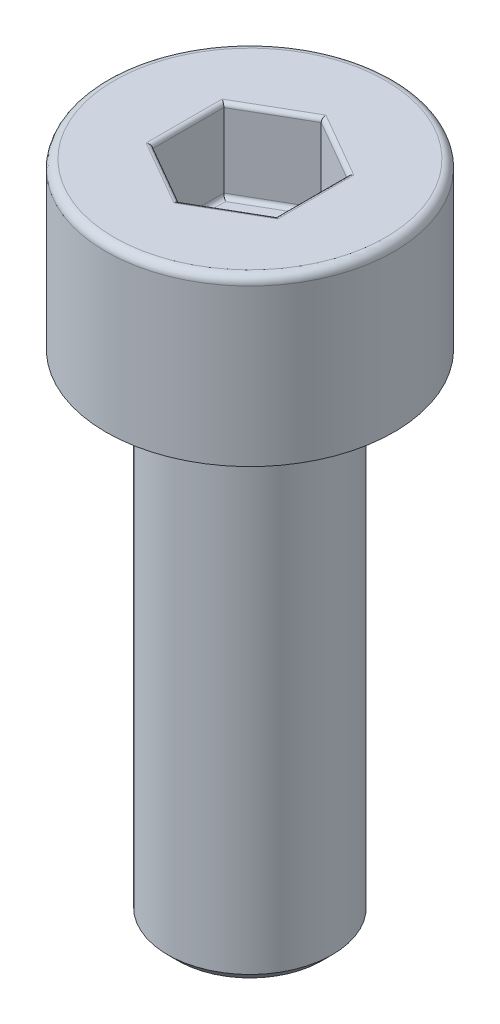
ISO-10303-21;
HEADER;
FILE_DESCRIPTION(('STEP AP214'),'2;1');
FILE_NAME('part.step','',(''),(''),'','','');
FILE_SCHEMA(('AUTOMOTIVE_DESIGN { 1 0 10303 214 1 1 1 1 }'));
ENDSEC;
DATA;
#1=APPLICATION_CONTEXT('core data for automotive mechanical design processes');
#2=APPLICATION_PROTOCOL_DEFINITION('international standard','automotive_design',2000,#1);
#3=PRODUCT_CONTEXT('',#1,'mechanical');
#4=PRODUCT('Part','Part','',(#3));
#5=PRODUCT_RELATED_PRODUCT_CATEGORY('part','',(#4));
#6=PRODUCT_DEFINITION_FORMATION('','',#4);
#7=PRODUCT_DEFINITION_CONTEXT('part definition',#1,'design');
#8=PRODUCT_DEFINITION('design','',#6,#7);
#9=PRODUCT_DEFINITION_SHAPE('','',#8);
#10=(LENGTH_UNIT() NAMED_UNIT(*) SI_UNIT(.MILLI.,.METRE.));
#11=(NAMED_UNIT(*) PLANE_ANGLE_UNIT() SI_UNIT($,.RADIAN.));
#12=(NAMED_UNIT(*) SI_UNIT($,.STERADIAN.) SOLID_ANGLE_UNIT());
#13=UNCERTAINTY_MEASURE_WITH_UNIT(LENGTH_MEASURE(1.E-05),#10,'distance_accuracy_value','');
#14=(GEOMETRIC_REPRESENTATION_CONTEXT(3) GLOBAL_UNCERTAINTY_ASSIGNED_CONTEXT((#13)) GLOBAL_UNIT_ASSIGNED_CONTEXT((#10,
#11,#12)) REPRESENTATION_CONTEXT('',''));
#15=CARTESIAN_POINT('',(0.,0.,0.));
#16=DIRECTION('',(0.,0.,1.));
#17=DIRECTION('',(1.,0.,0.));
#18=AXIS2_PLACEMENT_3D('',#15,#16,#17);
#19=CARTESIAN_POINT('',(0.,-16.,0.));
#20=DIRECTION('',(0.,-1.,0.));
#21=DIRECTION('',(0.,0.,-1.));
#22=AXIS2_PLACEMENT_3D('',#19,#20,#21);
#23=PLANE('',#22);
#24=CARTESIAN_POINT('',(0.,-16.,0.));
#25=DIRECTION('',(0.,-1.,0.));
#26=DIRECTION('',(0.,0.,-1.));
#27=AXIS2_PLACEMENT_3D('',#24,#25,#26);
#28=CIRCLE('',#27,1.75);
#29=CARTESIAN_POINT('',(0.,-16.,-1.75));
#30=VERTEX_POINT('',#29);
#31=EDGE_CURVE('E261',#30,#30,#28,.T.);
#32=ORIENTED_EDGE('',*,*,#31,.T.);
#33=EDGE_LOOP('',(#32));
#34=FACE_BOUND('',#33,.T.);
#35=ADVANCED_FACE('F33',(#34),#23,.T.);
#36=CARTESIAN_POINT('',(0.,0.,0.));
#37=DIRECTION('',(0.,1.,0.));
#38=DIRECTION('',(0.,0.,1.));
#39=AXIS2_PLACEMENT_3D('',#36,#37,#38);
#40=CYLINDRICAL_SURFACE('',#39,2.);
#41=CARTESIAN_POINT('',(0.,-4.25,0.));
#42=DIRECTION('',(0.,-1.,0.));
#43=DIRECTION('',(0.,0.,-1.));
#44=AXIS2_PLACEMENT_3D('',#41,#42,#43);
#45=CIRCLE('',#44,2.);
#46=CARTESIAN_POINT('',(0.,-4.25,-2.));
#47=VERTEX_POINT('',#46);
#48=EDGE_CURVE('E258',#47,#47,#45,.T.);
#49=ORIENTED_EDGE('',*,*,#48,.T.);
#50=EDGE_LOOP('',(#49));
#51=FACE_BOUND('',#50,.T.);
#52=CARTESIAN_POINT('',(0.,-15.75,0.));
#53=DIRECTION('',(0.,-1.,0.));
#54=DIRECTION('',(0.,0.,-1.));
#55=AXIS2_PLACEMENT_3D('',#52,#53,#54);
#56=CIRCLE('',#55,2.);
#57=CARTESIAN_POINT('',(0.,-15.75,-2.));
#58=VERTEX_POINT('',#57);
#59=EDGE_CURVE('E255',#58,#58,#56,.F.);
#60=ORIENTED_EDGE('',*,*,#59,.T.);
#61=EDGE_LOOP('',(#60));
#62=FACE_BOUND('',#61,.T.);
#63=ADVANCED_FACE('F287',(#51,#62),#40,.T.);
#64=CARTESIAN_POINT('',(-2.,-4.,0.));
#65=DIRECTION('',(0.,-1.,0.));
#66=DIRECTION('',(0.,0.,-1.));
#67=AXIS2_PLACEMENT_3D('',#64,#65,#66);
#68=PLANE('',#67);
#69=CARTESIAN_POINT('',(0.,-4.,0.));
#70=DIRECTION('',(0.,-1.,0.));
#71=DIRECTION('',(0.,0.,-1.));
#72=AXIS2_PLACEMENT_3D('',#69,#70,#71);
#73=CIRCLE('',#72,2.25);
#74=CARTESIAN_POINT('',(0.,-4.,-2.25));
#75=VERTEX_POINT('',#74);
#76=EDGE_CURVE('E252',#75,#75,#73,.F.);
#77=ORIENTED_EDGE('',*,*,#76,.T.);
#78=EDGE_LOOP('',(#77));
#79=FACE_BOUND('',#78,.T.);
#80=CARTESIAN_POINT('',(0.,-4.,0.));
#81=DIRECTION('',(0.,1.,0.));
#82=DIRECTION('',(0.,0.,1.));
#83=AXIS2_PLACEMENT_3D('',#80,#81,#82);
#84=CIRCLE('',#83,3.5);
#85=CARTESIAN_POINT('',(0.,-4.,3.5));
#86=VERTEX_POINT('',#85);
#87=EDGE_CURVE('E249',#86,#86,#84,.T.);
#88=ORIENTED_EDGE('',*,*,#87,.F.);
#89=EDGE_LOOP('',(#88));
#90=FACE_BOUND('',#89,.T.);
#91=ADVANCED_FACE('F293',(#79,#90),#68,.T.);
#92=CARTESIAN_POINT('',(0.,0.,0.));
#93=DIRECTION('',(0.,1.,0.));
#94=DIRECTION('',(0.,0.,1.));
#95=AXIS2_PLACEMENT_3D('',#92,#93,#94);
#96=CYLINDRICAL_SURFACE('',#95,3.5);
#97=CARTESIAN_POINT('',(0.,-0.2,0.));
#98=DIRECTION('',(0.,1.,0.));
#99=DIRECTION('',(0.,0.,1.));
#100=AXIS2_PLACEMENT_3D('',#97,#98,#99);
#101=CIRCLE('',#100,3.5);
#102=CARTESIAN_POINT('',(0.,-0.2,3.5));
#103=VERTEX_POINT('',#102);
#104=EDGE_CURVE('E159',#103,#103,#101,.F.);
#105=ORIENTED_EDGE('',*,*,#104,.T.);
#106=EDGE_LOOP('',(#105));
#107=FACE_BOUND('',#106,.T.);
#108=ORIENTED_EDGE('',*,*,#87,.T.);
#109=EDGE_LOOP('',(#108));
#110=FACE_BOUND('',#109,.T.);
#111=ADVANCED_FACE('F303',(#107,#110),#96,.T.);
#112=CARTESIAN_POINT('',(-3.5,0.,0.));
#113=DIRECTION('',(0.,1.,0.));
#114=DIRECTION('',(0.,0.,1.));
#115=AXIS2_PLACEMENT_3D('',#112,#113,#114);
#116=PLANE('',#115);
#117=DIRECTION('',(0.,0.,1.));
#118=VECTOR('',#117,1.);
#119=CARTESIAN_POINT('',(-1.6,0.,-0.86602540378444));
#120=LINE('',#119,#118);
#121=CARTESIAN_POINT('',(-1.6,0.,0.923760430703401));
#122=VERTEX_POINT('',#121);
#123=CARTESIAN_POINT('',(-1.6,0.,-0.923760430703403));
#124=VERTEX_POINT('',#123);
#125=EDGE_CURVE('E175',#122,#124,#120,.F.);
#126=ORIENTED_EDGE('',*,*,#125,.T.);
#127=DIRECTION('',(-0.866025403784439,0.,0.5));
#128=VECTOR('',#127,1.);
#129=CARTESIAN_POINT('',(-0.0499999999999999,0.,-1.81865334794732));
#130=LINE('',#129,#128);
#131=CARTESIAN_POINT('',(0.,0.,-1.8475208614068));
#132=VERTEX_POINT('',#131);
#133=EDGE_CURVE('E134',#124,#132,#130,.F.);
#134=ORIENTED_EDGE('',*,*,#133,.T.);
#135=DIRECTION('',(-0.866025403784439,0.,-0.5));
#136=VECTOR('',#135,1.);
#137=CARTESIAN_POINT('',(1.55,0.,-0.952627944162884));
#138=LINE('',#137,#136);
#139=CARTESIAN_POINT('',(1.6,0.,-0.923760430703403));
#140=VERTEX_POINT('',#139);
#141=EDGE_CURVE('E161',#132,#140,#138,.F.);
#142=ORIENTED_EDGE('',*,*,#141,.T.);
#143=DIRECTION('',(0.,0.,-1.));
#144=VECTOR('',#143,1.);
#145=CARTESIAN_POINT('',(1.6,0.,0.866025403784439));
#146=LINE('',#145,#144);
#147=CARTESIAN_POINT('',(1.6,0.,0.923760430703402));
#148=VERTEX_POINT('',#147);
#149=EDGE_CURVE('E169',#140,#148,#146,.F.);
#150=ORIENTED_EDGE('',*,*,#149,.T.);
#151=DIRECTION('',(0.866025403784439,0.,-0.5));
#152=VECTOR('',#151,1.);
#153=CARTESIAN_POINT('',(0.0499999999999988,0.,1.81865334794732));
#154=LINE('',#153,#152);
#155=CARTESIAN_POINT('',(0.,0.,1.8475208614068));
#156=VERTEX_POINT('',#155);
#157=EDGE_CURVE('E171',#148,#156,#154,.F.);
#158=ORIENTED_EDGE('',*,*,#157,.T.);
#159=DIRECTION('',(0.866025403784439,0.,0.5));
#160=VECTOR('',#159,1.);
#161=CARTESIAN_POINT('',(-1.55,0.,0.952627944162882));
#162=LINE('',#161,#160);
#163=EDGE_CURVE('E173',#156,#122,#162,.F.);
#164=ORIENTED_EDGE('',*,*,#163,.T.);
#165=EDGE_LOOP('',(#126,#134,#142,#150,#158,#164));
#166=FACE_BOUND('',#165,.T.);
#167=CARTESIAN_POINT('',(0.,0.,0.));
#168=DIRECTION('',(0.,1.,0.));
#169=DIRECTION('',(0.,0.,1.));
#170=AXIS2_PLACEMENT_3D('',#167,#168,#169);
#171=CIRCLE('',#170,3.3);
#172=CARTESIAN_POINT('',(0.,0.,3.3));
#173=VERTEX_POINT('',#172);
#174=EDGE_CURVE('E164',#173,#173,#171,.T.);
#175=ORIENTED_EDGE('',*,*,#174,.T.);
#176=EDGE_LOOP('',(#175));
#177=FACE_BOUND('',#176,.T.);
#178=ADVANCED_FACE('F266',(#166,#177),#116,.T.);
#179=CARTESIAN_POINT('',(0.,-4.,0.));
#180=DIRECTION('',(0.,1.,0.));
#181=DIRECTION('',(0.,0.,1.));
#182=AXIS2_PLACEMENT_3D('',#179,#180,#181);
#183=CONICAL_SURFACE('',#182,2.25,0.785398163397454);
#184=ORIENTED_EDGE('',*,*,#48,.F.);
#185=EDGE_LOOP('',(#184));
#186=FACE_BOUND('',#185,.T.);
#187=ORIENTED_EDGE('',*,*,#76,.F.);
#188=EDGE_LOOP('',(#187));
#189=FACE_BOUND('',#188,.T.);
#190=ADVANCED_FACE('F281',(#186,#189),#183,.T.);
#191=CARTESIAN_POINT('',(0.,-15.75,0.));
#192=DIRECTION('',(0.,1.,0.));
#193=DIRECTION('',(0.,0.,1.));
#194=AXIS2_PLACEMENT_3D('',#191,#192,#193);
#195=CONICAL_SURFACE('',#194,2.,0.785398163397446);
#196=ORIENTED_EDGE('',*,*,#31,.F.);
#197=EDGE_LOOP('',(#196));
#198=FACE_BOUND('',#197,.T.);
#199=ORIENTED_EDGE('',*,*,#59,.F.);
#200=EDGE_LOOP('',(#199));
#201=FACE_BOUND('',#200,.T.);
#202=ADVANCED_FACE('F271',(#198,#201),#195,.T.);
#203=CARTESIAN_POINT('',(0.,-0.2,0.));
#204=DIRECTION('',(0.,1.,0.));
#205=DIRECTION('',(0.,0.,1.));
#206=AXIS2_PLACEMENT_3D('',#203,#204,#205);
#207=TOROIDAL_SURFACE('',#206,3.3,0.2);
#208=ORIENTED_EDGE('',*,*,#104,.F.);
#209=EDGE_LOOP('',(#208));
#210=FACE_BOUND('',#209,.T.);
#211=ORIENTED_EDGE('',*,*,#174,.F.);
#212=EDGE_LOOP('',(#211));
#213=FACE_BOUND('',#212,.T.);
#214=ADVANCED_FACE('F268',(#210,#213),#207,.T.);
#215=CARTESIAN_POINT('',(1.5,-2.,-0.86602540378444));
#216=DIRECTION('',(0.5,0.,-0.866025403784439));
#217=DIRECTION('',(-0.866025403784439,0.,-0.5));
#218=AXIS2_PLACEMENT_3D('',#215,#216,#217);
#219=PLANE('',#218);
#220=DIRECTION('',(0.,1.,0.));
#221=VECTOR('',#220,1.);
#222=CARTESIAN_POINT('',(1.5,-2.,-0.86602540378444));
#223=LINE('',#222,#221);
#224=CARTESIAN_POINT('',(1.5,-1.9,-0.86602540378444));
#225=VERTEX_POINT('',#224);
#226=CARTESIAN_POINT('',(1.5,-0.1,-0.86602540378444));
#227=VERTEX_POINT('',#226);
#228=EDGE_CURVE('E243',#225,#227,#223,.T.);
#229=ORIENTED_EDGE('',*,*,#228,.T.);
#230=DIRECTION('',(-0.866025403784439,0.,-0.5));
#231=VECTOR('',#230,1.);
#232=CARTESIAN_POINT('',(0.,-0.1,-1.73205080756888));
#233=LINE('',#232,#231);
#234=CARTESIAN_POINT('',(0.,-0.1,-1.73205080756888));
#235=VERTEX_POINT('',#234);
#236=EDGE_CURVE('E195',#227,#235,#233,.T.);
#237=ORIENTED_EDGE('',*,*,#236,.T.);
#238=DIRECTION('',(0.,1.,0.));
#239=VECTOR('',#238,1.);
#240=CARTESIAN_POINT('',(0.,-2.,-1.73205080756888));
#241=LINE('',#240,#239);
#242=CARTESIAN_POINT('',(0.,-1.9,-1.73205080756888));
#243=VERTEX_POINT('',#242);
#244=EDGE_CURVE('E145',#243,#235,#241,.T.);
#245=ORIENTED_EDGE('',*,*,#244,.F.);
#246=DIRECTION('',(-0.866025403784439,0.,-0.5));
#247=VECTOR('',#246,1.);
#248=CARTESIAN_POINT('',(1.5,-1.9,-0.86602540378444));
#249=LINE('',#248,#247);
#250=EDGE_CURVE('E193',#243,#225,#249,.F.);
#251=ORIENTED_EDGE('',*,*,#250,.T.);
#252=EDGE_LOOP('',(#229,#237,#245,#251));
#253=FACE_BOUND('',#252,.T.);
#254=ADVANCED_FACE('F270',(#253),#219,.F.);
#255=CARTESIAN_POINT('',(1.5,-2.,0.866025403784439));
#256=DIRECTION('',(1.,0.,0.));
#257=DIRECTION('',(0.,0.,-1.));
#258=AXIS2_PLACEMENT_3D('',#255,#256,#257);
#259=PLANE('',#258);
#260=DIRECTION('',(0.,1.,0.));
#261=VECTOR('',#260,1.);
#262=CARTESIAN_POINT('',(1.5,-2.,0.866025403784439));
#263=LINE('',#262,#261);
#264=CARTESIAN_POINT('',(1.5,-1.9,0.866025403784439));
#265=VERTEX_POINT('',#264);
#266=CARTESIAN_POINT('',(1.5,-0.1,0.866025403784439));
#267=VERTEX_POINT('',#266);
#268=EDGE_CURVE('E240',#265,#267,#263,.T.);
#269=ORIENTED_EDGE('',*,*,#268,.T.);
#270=DIRECTION('',(0.,0.,-1.));
#271=VECTOR('',#270,1.);
#272=CARTESIAN_POINT('',(1.5,-0.1,-0.86602540378444));
#273=LINE('',#272,#271);
#274=EDGE_CURVE('E191',#267,#227,#273,.T.);
#275=ORIENTED_EDGE('',*,*,#274,.T.);
#276=ORIENTED_EDGE('',*,*,#228,.F.);
#277=DIRECTION('',(0.,0.,-1.));
#278=VECTOR('',#277,1.);
#279=CARTESIAN_POINT('',(1.5,-1.9,0.866025403784439));
#280=LINE('',#279,#278);
#281=EDGE_CURVE('E188',#225,#265,#280,.F.);
#282=ORIENTED_EDGE('',*,*,#281,.T.);
#283=EDGE_LOOP('',(#269,#275,#276,#282));
#284=FACE_BOUND('',#283,.T.);
#285=ADVANCED_FACE('F278',(#284),#259,.F.);
#286=CARTESIAN_POINT('',(0.,-2.,1.73205080756888));
#287=DIRECTION('',(0.5,0.,0.866025403784439));
#288=DIRECTION('',(0.866025403784439,0.,-0.5));
#289=AXIS2_PLACEMENT_3D('',#286,#287,#288);
#290=PLANE('',#289);
#291=DIRECTION('',(0.,1.,0.));
#292=VECTOR('',#291,1.);
#293=CARTESIAN_POINT('',(0.,-2.,1.73205080756888));
#294=LINE('',#293,#292);
#295=CARTESIAN_POINT('',(0.,-1.9,1.73205080756888));
#296=VERTEX_POINT('',#295);
#297=CARTESIAN_POINT('',(0.,-0.1,1.73205080756888));
#298=VERTEX_POINT('',#297);
#299=EDGE_CURVE('E237',#296,#298,#294,.T.);
#300=ORIENTED_EDGE('',*,*,#299,.T.);
#301=DIRECTION('',(0.866025403784439,0.,-0.5));
#302=VECTOR('',#301,1.);
#303=CARTESIAN_POINT('',(1.5,-0.1,0.866025403784439));
#304=LINE('',#303,#302);
#305=EDGE_CURVE('E186',#298,#267,#304,.T.);
#306=ORIENTED_EDGE('',*,*,#305,.T.);
#307=ORIENTED_EDGE('',*,*,#268,.F.);
#308=DIRECTION('',(0.866025403784439,0.,-0.5));
#309=VECTOR('',#308,1.);
#310=CARTESIAN_POINT('',(0.,-1.9,1.73205080756888));
#311=LINE('',#310,#309);
#312=EDGE_CURVE('E184',#265,#296,#311,.F.);
#313=ORIENTED_EDGE('',*,*,#312,.T.);
#314=EDGE_LOOP('',(#300,#306,#307,#313));
#315=FACE_BOUND('',#314,.T.);
#316=ADVANCED_FACE('F327',(#315),#290,.F.);
#317=CARTESIAN_POINT('',(-1.5,-2.,0.866025403784438));
#318=DIRECTION('',(-0.5,0.,0.866025403784439));
#319=DIRECTION('',(0.866025403784439,0.,0.5));
#320=AXIS2_PLACEMENT_3D('',#317,#318,#319);
#321=PLANE('',#320);
#322=DIRECTION('',(0.,1.,0.));
#323=VECTOR('',#322,1.);
#324=CARTESIAN_POINT('',(-1.5,-2.,0.866025403784438));
#325=LINE('',#324,#323);
#326=CARTESIAN_POINT('',(-1.5,-1.9,0.866025403784438));
#327=VERTEX_POINT('',#326);
#328=CARTESIAN_POINT('',(-1.5,-0.1,0.866025403784438));
#329=VERTEX_POINT('',#328);
#330=EDGE_CURVE('E128',#327,#329,#325,.T.);
#331=ORIENTED_EDGE('',*,*,#330,.T.);
#332=DIRECTION('',(0.866025403784439,0.,0.5));
#333=VECTOR('',#332,1.);
#334=CARTESIAN_POINT('',(0.,-0.1,1.73205080756888));
#335=LINE('',#334,#333);
#336=EDGE_CURVE('E182',#329,#298,#335,.T.);
#337=ORIENTED_EDGE('',*,*,#336,.T.);
#338=ORIENTED_EDGE('',*,*,#299,.F.);
#339=DIRECTION('',(0.866025403784439,0.,0.5));
#340=VECTOR('',#339,1.);
#341=CARTESIAN_POINT('',(-1.5,-1.9,0.866025403784438));
#342=LINE('',#341,#340);
#343=EDGE_CURVE('E180',#296,#327,#342,.F.);
#344=ORIENTED_EDGE('',*,*,#343,.T.);
#345=EDGE_LOOP('',(#331,#337,#338,#344));
#346=FACE_BOUND('',#345,.T.);
#347=ADVANCED_FACE('F234',(#346),#321,.F.);
#348=CARTESIAN_POINT('',(-1.5,-2.,-0.86602540378444));
#349=DIRECTION('',(-1.,0.,0.));
#350=DIRECTION('',(0.,0.,1.));
#351=AXIS2_PLACEMENT_3D('',#348,#349,#350);
#352=PLANE('',#351);
#353=DIRECTION('',(0.,1.,0.));
#354=VECTOR('',#353,1.);
#355=CARTESIAN_POINT('',(-1.5,-2.,-0.86602540378444));
#356=LINE('',#355,#354);
#357=CARTESIAN_POINT('',(-1.5,-1.9,-0.86602540378444));
#358=VERTEX_POINT('',#357);
#359=CARTESIAN_POINT('',(-1.5,-0.1,-0.86602540378444));
#360=VERTEX_POINT('',#359);
#361=EDGE_CURVE('E126',#358,#360,#356,.T.);
#362=ORIENTED_EDGE('',*,*,#361,.T.);
#363=DIRECTION('',(0.,0.,1.));
#364=VECTOR('',#363,1.);
#365=CARTESIAN_POINT('',(-1.5,-0.1,0.866025403784438));
#366=LINE('',#365,#364);
#367=EDGE_CURVE('E133',#360,#329,#366,.T.);
#368=ORIENTED_EDGE('',*,*,#367,.T.);
#369=ORIENTED_EDGE('',*,*,#330,.F.);
#370=DIRECTION('',(0.,0.,1.));
#371=VECTOR('',#370,1.);
#372=CARTESIAN_POINT('',(-1.5,-1.9,-0.86602540378444));
#373=LINE('',#372,#371);
#374=EDGE_CURVE('E123',#327,#358,#373,.F.);
#375=ORIENTED_EDGE('',*,*,#374,.T.);
#376=EDGE_LOOP('',(#362,#368,#369,#375));
#377=FACE_BOUND('',#376,.T.);
#378=ADVANCED_FACE('F125',(#377),#352,.F.);
#379=CARTESIAN_POINT('',(0.,-2.,-1.73205080756888));
#380=DIRECTION('',(-0.5,0.,-0.866025403784439));
#381=DIRECTION('',(-0.866025403784439,0.,0.5));
#382=AXIS2_PLACEMENT_3D('',#379,#380,#381);
#383=PLANE('',#382);
#384=ORIENTED_EDGE('',*,*,#244,.T.);
#385=DIRECTION('',(-0.866025403784439,0.,0.5));
#386=VECTOR('',#385,1.);
#387=CARTESIAN_POINT('',(-1.5,-0.1,-0.86602540378444));
#388=LINE('',#387,#386);
#389=EDGE_CURVE('E144',#235,#360,#388,.T.);
#390=ORIENTED_EDGE('',*,*,#389,.T.);
#391=ORIENTED_EDGE('',*,*,#361,.F.);
#392=DIRECTION('',(-0.866025403784439,0.,0.5));
#393=VECTOR('',#392,1.);
#394=CARTESIAN_POINT('',(0.,-1.9,-1.73205080756888));
#395=LINE('',#394,#393);
#396=EDGE_CURVE('E141',#358,#243,#395,.F.);
#397=ORIENTED_EDGE('',*,*,#396,.T.);
#398=EDGE_LOOP('',(#384,#390,#391,#397));
#399=FACE_BOUND('',#398,.T.);
#400=ADVANCED_FACE('F139',(#399),#383,.F.);
#401=CARTESIAN_POINT('',(1.5,-2.,-0.86602540378444));
#402=DIRECTION('',(0.,-1.,0.));
#403=DIRECTION('',(0.,0.,-1.));
#404=AXIS2_PLACEMENT_3D('',#401,#402,#403);
#405=PLANE('',#404);
#406=DIRECTION('',(0.866025403784439,0.,-0.5));
#407=VECTOR('',#406,1.);
#408=CARTESIAN_POINT('',(1.45,-2.,0.779422863405995));
#409=LINE('',#408,#407);
#410=CARTESIAN_POINT('',(0.,-2.,1.61658075373095));
#411=VERTEX_POINT('',#410);
#412=CARTESIAN_POINT('',(1.4,-2.,0.808290376865476));
#413=VERTEX_POINT('',#412);
#414=EDGE_CURVE('E42',#411,#413,#409,.T.);
#415=ORIENTED_EDGE('',*,*,#414,.T.);
#416=DIRECTION('',(0.,0.,-1.));
#417=VECTOR('',#416,1.);
#418=CARTESIAN_POINT('',(1.4,-2.,-0.86602540378444));
#419=LINE('',#418,#417);
#420=CARTESIAN_POINT('',(1.4,-2.,-0.808290376865478));
#421=VERTEX_POINT('',#420);
#422=EDGE_CURVE('E11',#413,#421,#419,.T.);
#423=ORIENTED_EDGE('',*,*,#422,.T.);
#424=DIRECTION('',(-0.866025403784439,0.,-0.5));
#425=VECTOR('',#424,1.);
#426=CARTESIAN_POINT('',(-0.0500000000000001,-2.,-1.64544826719043));
#427=LINE('',#426,#425);
#428=CARTESIAN_POINT('',(0.,-2.,-1.61658075373095));
#429=VERTEX_POINT('',#428);
#430=EDGE_CURVE('E197',#421,#429,#427,.T.);
#431=ORIENTED_EDGE('',*,*,#430,.T.);
#432=DIRECTION('',(-0.866025403784439,0.,0.5));
#433=VECTOR('',#432,1.);
#434=CARTESIAN_POINT('',(-1.45,-2.,-0.779422863405997));
#435=LINE('',#434,#433);
#436=CARTESIAN_POINT('',(-1.4,-2.,-0.808290376865478));
#437=VERTEX_POINT('',#436);
#438=EDGE_CURVE('E199',#429,#437,#435,.T.);
#439=ORIENTED_EDGE('',*,*,#438,.T.);
#440=DIRECTION('',(0.,0.,1.));
#441=VECTOR('',#440,1.);
#442=CARTESIAN_POINT('',(-1.4,-2.,0.866025403784438));
#443=LINE('',#442,#441);
#444=CARTESIAN_POINT('',(-1.4,-2.,0.808290376865476));
#445=VERTEX_POINT('',#444);
#446=EDGE_CURVE('E150',#437,#445,#443,.T.);
#447=ORIENTED_EDGE('',*,*,#446,.T.);
#448=DIRECTION('',(0.866025403784439,0.,0.5));
#449=VECTOR('',#448,1.);
#450=CARTESIAN_POINT('',(0.0499999999999989,-2.,1.64544826719043));
#451=LINE('',#450,#449);
#452=EDGE_CURVE('E53',#445,#411,#451,.T.);
#453=ORIENTED_EDGE('',*,*,#452,.T.);
#454=EDGE_LOOP('',(#415,#423,#431,#439,#447,#453));
#455=FACE_BOUND('',#454,.T.);
#456=ADVANCED_FACE('F322',(#455),#405,.F.);
#457=CARTESIAN_POINT('',(0.0499999999999988,-0.1,1.81865334794732));
#458=DIRECTION('',(-0.866025403784439,0.,0.5));
#459=DIRECTION('',(0.5,0.,0.866025403784439));
#460=AXIS2_PLACEMENT_3D('',#457,#458,#459);
#461=CYLINDRICAL_SURFACE('',#460,0.1);
#462=CARTESIAN_POINT('',(0.,-0.1,1.8475208614068));
#463=DIRECTION('',(-1.,0.,0.));
#464=DIRECTION('',(0.,0.,-1.));
#465=AXIS2_PLACEMENT_3D('',#462,#463,#464);
#466=ELLIPSE('',#465,0.115470053837925,0.1);
#467=EDGE_CURVE('E214',#156,#298,#466,.T.);
#468=ORIENTED_EDGE('',*,*,#467,.F.);
#469=ORIENTED_EDGE('',*,*,#157,.F.);
#470=CARTESIAN_POINT('',(1.6,-0.1,0.923760430703402));
#471=DIRECTION('',(-0.5,0.,0.866025403784439));
#472=DIRECTION('',(-0.866025403784439,0.,-0.5));
#473=AXIS2_PLACEMENT_3D('',#470,#471,#472);
#474=ELLIPSE('',#473,0.115470053837925,0.1);
#475=EDGE_CURVE('E217',#267,#148,#474,.F.);
#476=ORIENTED_EDGE('',*,*,#475,.F.);
#477=ORIENTED_EDGE('',*,*,#305,.F.);
#478=EDGE_LOOP('',(#468,#469,#476,#477));
#479=FACE_BOUND('',#478,.T.);
#480=ADVANCED_FACE('F334',(#479),#461,.T.);
#481=CARTESIAN_POINT('',(1.6,-0.1,0.866025403784439));
#482=DIRECTION('',(0.,0.,1.));
#483=DIRECTION('',(1.,0.,0.));
#484=AXIS2_PLACEMENT_3D('',#481,#482,#483);
#485=CYLINDRICAL_SURFACE('',#484,0.1);
#486=ORIENTED_EDGE('',*,*,#475,.T.);
#487=ORIENTED_EDGE('',*,*,#149,.F.);
#488=CARTESIAN_POINT('',(1.6,-0.1,-0.923760430703402));
#489=DIRECTION('',(0.5,0.,0.866025403784439));
#490=DIRECTION('',(-0.866025403784439,0.,0.5));
#491=AXIS2_PLACEMENT_3D('',#488,#489,#490);
#492=ELLIPSE('',#491,0.115470053837925,0.1);
#493=EDGE_CURVE('E211',#227,#140,#492,.F.);
#494=ORIENTED_EDGE('',*,*,#493,.F.);
#495=ORIENTED_EDGE('',*,*,#274,.F.);
#496=EDGE_LOOP('',(#486,#487,#494,#495));
#497=FACE_BOUND('',#496,.T.);
#498=ADVANCED_FACE('F338',(#497),#485,.T.);
#499=CARTESIAN_POINT('',(-1.55,-0.1,0.952627944162882));
#500=DIRECTION('',(-0.866025403784439,0.,-0.5));
#501=DIRECTION('',(-0.5,0.,0.866025403784439));
#502=AXIS2_PLACEMENT_3D('',#499,#500,#501);
#503=CYLINDRICAL_SURFACE('',#502,0.1);
#504=ORIENTED_EDGE('',*,*,#467,.T.);
#505=ORIENTED_EDGE('',*,*,#336,.F.);
#506=CARTESIAN_POINT('',(-1.6,-0.1,0.923760430703401));
#507=DIRECTION('',(-0.5,0.,-0.866025403784439));
#508=DIRECTION('',(0.866025403784439,0.,-0.5));
#509=AXIS2_PLACEMENT_3D('',#506,#507,#508);
#510=ELLIPSE('',#509,0.115470053837925,0.1);
#511=EDGE_CURVE('E208',#122,#329,#510,.T.);
#512=ORIENTED_EDGE('',*,*,#511,.F.);
#513=ORIENTED_EDGE('',*,*,#163,.F.);
#514=EDGE_LOOP('',(#504,#505,#512,#513));
#515=FACE_BOUND('',#514,.T.);
#516=ADVANCED_FACE('F344',(#515),#503,.T.);
#517=CARTESIAN_POINT('',(1.55,-0.1,-0.952627944162884));
#518=DIRECTION('',(0.866025403784439,0.,0.5));
#519=DIRECTION('',(0.5,0.,-0.866025403784439));
#520=AXIS2_PLACEMENT_3D('',#517,#518,#519);
#521=CYLINDRICAL_SURFACE('',#520,0.1);
#522=ORIENTED_EDGE('',*,*,#493,.T.);
#523=ORIENTED_EDGE('',*,*,#141,.F.);
#524=CARTESIAN_POINT('',(0.,-0.1,-1.8475208614068));
#525=DIRECTION('',(1.,0.,0.));
#526=DIRECTION('',(0.,0.,-1.));
#527=AXIS2_PLACEMENT_3D('',#524,#525,#526);
#528=ELLIPSE('',#527,0.115470053837925,0.1);
#529=EDGE_CURVE('E206',#235,#132,#528,.F.);
#530=ORIENTED_EDGE('',*,*,#529,.F.);
#531=ORIENTED_EDGE('',*,*,#236,.F.);
#532=EDGE_LOOP('',(#522,#523,#530,#531));
#533=FACE_BOUND('',#532,.T.);
#534=ADVANCED_FACE('F374',(#533),#521,.T.);
#535=CARTESIAN_POINT('',(-1.6,-0.1,-0.86602540378444));
#536=DIRECTION('',(0.,0.,-1.));
#537=DIRECTION('',(-1.,0.,0.));
#538=AXIS2_PLACEMENT_3D('',#535,#536,#537);
#539=CYLINDRICAL_SURFACE('',#538,0.1);
#540=ORIENTED_EDGE('',*,*,#511,.T.);
#541=ORIENTED_EDGE('',*,*,#367,.F.);
#542=CARTESIAN_POINT('',(-1.6,-0.1,-0.923760430703403));
#543=DIRECTION('',(0.5,0.,-0.866025403784439));
#544=DIRECTION('',(0.866025403784439,0.,0.5));
#545=AXIS2_PLACEMENT_3D('',#542,#543,#544);
#546=ELLIPSE('',#545,0.115470053837925,0.1);
#547=EDGE_CURVE('E204',#124,#360,#546,.T.);
#548=ORIENTED_EDGE('',*,*,#547,.F.);
#549=ORIENTED_EDGE('',*,*,#125,.F.);
#550=EDGE_LOOP('',(#540,#541,#548,#549));
#551=FACE_BOUND('',#550,.T.);
#552=ADVANCED_FACE('F369',(#551),#539,.T.);
#553=CARTESIAN_POINT('',(-0.05,-0.1,-1.81865334794732));
#554=DIRECTION('',(0.866025403784439,0.,-0.5));
#555=DIRECTION('',(-0.5,0.,-0.866025403784439));
#556=AXIS2_PLACEMENT_3D('',#553,#554,#555);
#557=CYLINDRICAL_SURFACE('',#556,0.1);
#558=ORIENTED_EDGE('',*,*,#529,.T.);
#559=ORIENTED_EDGE('',*,*,#133,.F.);
#560=ORIENTED_EDGE('',*,*,#547,.T.);
#561=ORIENTED_EDGE('',*,*,#389,.F.);
#562=EDGE_LOOP('',(#558,#559,#560,#561));
#563=FACE_BOUND('',#562,.T.);
#564=ADVANCED_FACE('F365',(#563),#557,.T.);
#565=CARTESIAN_POINT('',(-1.4,-1.9,-0.86602540378444));
#566=DIRECTION('',(0.,0.,-1.));
#567=DIRECTION('',(-1.,0.,0.));
#568=AXIS2_PLACEMENT_3D('',#565,#566,#567);
#569=CYLINDRICAL_SURFACE('',#568,0.1);
#570=CARTESIAN_POINT('',(-1.4,-1.9,-0.808290376865478));
#571=DIRECTION('',(0.5,0.,-0.866025403784439));
#572=DIRECTION('',(-0.866025403784439,0.,-0.5));
#573=AXIS2_PLACEMENT_3D('',#570,#571,#572);
#574=ELLIPSE('',#573,0.115470053837925,0.1);
#575=EDGE_CURVE('E149',#358,#437,#574,.F.);
#576=ORIENTED_EDGE('',*,*,#575,.F.);
#577=ORIENTED_EDGE('',*,*,#374,.F.);
#578=CARTESIAN_POINT('',(-1.4,-1.9,0.808290376865476));
#579=DIRECTION('',(-0.5,0.,-0.866025403784439));
#580=DIRECTION('',(-0.866025403784439,0.,0.5));
#581=AXIS2_PLACEMENT_3D('',#578,#579,#580);
#582=ELLIPSE('',#581,0.115470053837925,0.1);
#583=EDGE_CURVE('E37',#445,#327,#582,.T.);
#584=ORIENTED_EDGE('',*,*,#583,.F.);
#585=ORIENTED_EDGE('',*,*,#446,.F.);
#586=EDGE_LOOP('',(#576,#577,#584,#585));
#587=FACE_BOUND('',#586,.T.);
#588=ADVANCED_FACE('F35',(#587),#569,.F.);
#589=CARTESIAN_POINT('',(0.0499999999999984,-1.9,1.64544826719043));
#590=DIRECTION('',(-0.866025403784439,0.,-0.5));
#591=DIRECTION('',(-0.5,0.,0.866025403784439));
#592=AXIS2_PLACEMENT_3D('',#589,#590,#591);
#593=CYLINDRICAL_SURFACE('',#592,0.1);
#594=ORIENTED_EDGE('',*,*,#583,.T.);
#595=ORIENTED_EDGE('',*,*,#343,.F.);
#596=CARTESIAN_POINT('',(0.,-1.9,1.61658075373095));
#597=DIRECTION('',(-1.,0.,0.));
#598=DIRECTION('',(0.,0.,1.));
#599=AXIS2_PLACEMENT_3D('',#596,#597,#598);
#600=ELLIPSE('',#599,0.115470053837925,0.1);
#601=EDGE_CURVE('E153',#411,#296,#600,.T.);
#602=ORIENTED_EDGE('',*,*,#601,.F.);
#603=ORIENTED_EDGE('',*,*,#452,.F.);
#604=EDGE_LOOP('',(#594,#595,#602,#603));
#605=FACE_BOUND('',#604,.T.);
#606=ADVANCED_FACE('F231',(#605),#593,.F.);
#607=CARTESIAN_POINT('',(0.8,-1.9,-2.07846096908265));
#608=DIRECTION('',(0.866025403784439,0.,-0.5));
#609=DIRECTION('',(-0.5,0.,-0.866025403784439));
#610=AXIS2_PLACEMENT_3D('',#607,#608,#609);
#611=CYLINDRICAL_SURFACE('',#610,0.1);
#612=ORIENTED_EDGE('',*,*,#575,.T.);
#613=ORIENTED_EDGE('',*,*,#438,.F.);
#614=CARTESIAN_POINT('',(0.,-1.9,-1.61658075373095));
#615=DIRECTION('',(1.,0.,0.));
#616=DIRECTION('',(0.,0.,-1.));
#617=AXIS2_PLACEMENT_3D('',#614,#615,#616);
#618=ELLIPSE('',#617,0.115470053837925,0.1);
#619=EDGE_CURVE('E157',#243,#429,#618,.F.);
#620=ORIENTED_EDGE('',*,*,#619,.F.);
#621=ORIENTED_EDGE('',*,*,#396,.F.);
#622=EDGE_LOOP('',(#612,#613,#620,#621));
#623=FACE_BOUND('',#622,.T.);
#624=ADVANCED_FACE('F155',(#623),#611,.F.);
#625=CARTESIAN_POINT('',(2.2,-1.9,0.346410161513775));
#626=DIRECTION('',(-0.866025403784439,0.,0.5));
#627=DIRECTION('',(0.5,0.,0.866025403784439));
#628=AXIS2_PLACEMENT_3D('',#625,#626,#627);
#629=CYLINDRICAL_SURFACE('',#628,0.1);
#630=ORIENTED_EDGE('',*,*,#601,.T.);
#631=ORIENTED_EDGE('',*,*,#312,.F.);
#632=CARTESIAN_POINT('',(1.4,-1.9,0.808290376865476));
#633=DIRECTION('',(-0.5,0.,0.866025403784439));
#634=DIRECTION('',(0.866025403784439,0.,0.5));
#635=AXIS2_PLACEMENT_3D('',#632,#633,#634);
#636=ELLIPSE('',#635,0.115470053837925,0.1);
#637=EDGE_CURVE('E222',#413,#265,#636,.T.);
#638=ORIENTED_EDGE('',*,*,#637,.F.);
#639=ORIENTED_EDGE('',*,*,#414,.F.);
#640=EDGE_LOOP('',(#630,#631,#638,#639));
#641=FACE_BOUND('',#640,.T.);
#642=ADVANCED_FACE('F228',(#641),#629,.F.);
#643=CARTESIAN_POINT('',(1.45,-1.9,-0.779422863405997));
#644=DIRECTION('',(0.866025403784439,0.,0.5));
#645=DIRECTION('',(0.5,0.,-0.866025403784439));
#646=AXIS2_PLACEMENT_3D('',#643,#644,#645);
#647=CYLINDRICAL_SURFACE('',#646,0.1);
#648=ORIENTED_EDGE('',*,*,#619,.T.);
#649=ORIENTED_EDGE('',*,*,#430,.F.);
#650=CARTESIAN_POINT('',(1.4,-1.9,-0.808290376865478));
#651=DIRECTION('',(0.5,0.,0.866025403784439));
#652=DIRECTION('',(-0.866025403784439,0.,0.5));
#653=AXIS2_PLACEMENT_3D('',#650,#651,#652);
#654=ELLIPSE('',#653,0.115470053837925,0.1);
#655=EDGE_CURVE('E220',#225,#421,#654,.F.);
#656=ORIENTED_EDGE('',*,*,#655,.F.);
#657=ORIENTED_EDGE('',*,*,#250,.F.);
#658=EDGE_LOOP('',(#648,#649,#656,#657));
#659=FACE_BOUND('',#658,.T.);
#660=ADVANCED_FACE('F353',(#659),#647,.F.);
#661=CARTESIAN_POINT('',(1.4,-1.9,-0.86602540378444));
#662=DIRECTION('',(0.,0.,1.));
#663=DIRECTION('',(1.,0.,0.));
#664=AXIS2_PLACEMENT_3D('',#661,#662,#663);
#665=CYLINDRICAL_SURFACE('',#664,0.1);
#666=ORIENTED_EDGE('',*,*,#637,.T.);
#667=ORIENTED_EDGE('',*,*,#281,.F.);
#668=ORIENTED_EDGE('',*,*,#655,.T.);
#669=ORIENTED_EDGE('',*,*,#422,.F.);
#670=EDGE_LOOP('',(#666,#667,#668,#669));
#671=FACE_BOUND('',#670,.T.);
#672=ADVANCED_FACE('F350',(#671),#665,.F.);
#673=CLOSED_SHELL('',(#35,#63,#91,#111,#178,#190,#202,#214,#254,#285,#316,#347,#378,#400,#456,
#480,#498,#516,#534,#552,#564,#588,#606,#624,#642,#660,#672));
#674=MANIFOLD_SOLID_BREP('B2',#673);
#675=ADVANCED_BREP_SHAPE_REPRESENTATION('',(#18,#674),#14);
#676=SHAPE_DEFINITION_REPRESENTATION(#9,#675);
ENDSEC;
END-ISO-10303-21;
